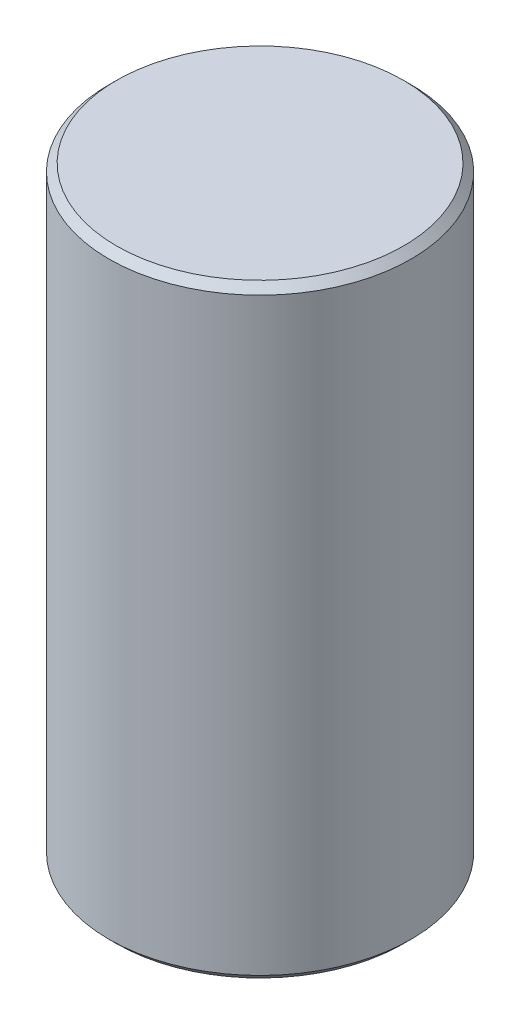
ISO-10303-21;
HEADER;
FILE_DESCRIPTION(('STEP AP214'),'2;1');
FILE_NAME('part.step','',(''),(''),'','','');
FILE_SCHEMA(('AUTOMOTIVE_DESIGN { 1 0 10303 214 1 1 1 1 }'));
ENDSEC;
DATA;
#1=APPLICATION_CONTEXT('core data for automotive mechanical design processes');
#2=APPLICATION_PROTOCOL_DEFINITION('international standard','automotive_design',2000,#1);
#3=PRODUCT_CONTEXT('',#1,'mechanical');
#4=PRODUCT('Part','Part','',(#3));
#5=PRODUCT_RELATED_PRODUCT_CATEGORY('part','',(#4));
#6=PRODUCT_DEFINITION_FORMATION('','',#4);
#7=PRODUCT_DEFINITION_CONTEXT('part definition',#1,'design');
#8=PRODUCT_DEFINITION('design','',#6,#7);
#9=PRODUCT_DEFINITION_SHAPE('','',#8);
#10=(LENGTH_UNIT() NAMED_UNIT(*) SI_UNIT(.MILLI.,.METRE.));
#11=(NAMED_UNIT(*) PLANE_ANGLE_UNIT() SI_UNIT($,.RADIAN.));
#12=(NAMED_UNIT(*) SI_UNIT($,.STERADIAN.) SOLID_ANGLE_UNIT());
#13=UNCERTAINTY_MEASURE_WITH_UNIT(LENGTH_MEASURE(1.E-05),#10,'distance_accuracy_value','');
#14=(GEOMETRIC_REPRESENTATION_CONTEXT(3) GLOBAL_UNCERTAINTY_ASSIGNED_CONTEXT((#13)) GLOBAL_UNIT_ASSIGNED_CONTEXT((#10,
#11,#12)) REPRESENTATION_CONTEXT('',''));
#15=CARTESIAN_POINT('',(0.,0.,0.));
#16=DIRECTION('',(0.,0.,1.));
#17=DIRECTION('',(1.,0.,0.));
#18=AXIS2_PLACEMENT_3D('',#15,#16,#17);
#19=CARTESIAN_POINT('',(0.,5.,0.));
#20=DIRECTION('',(0.,-1.,0.));
#21=DIRECTION('',(0.,0.,-1.));
#22=AXIS2_PLACEMENT_3D('',#19,#20,#21);
#23=CYLINDRICAL_SURFACE('',#22,2.5);
#24=CARTESIAN_POINT('',(0.,-4.875,0.));
#25=DIRECTION('',(0.,1.,0.));
#26=DIRECTION('',(0.,0.,1.));
#27=AXIS2_PLACEMENT_3D('',#24,#25,#26);
#28=CIRCLE('',#27,2.5);
#29=CARTESIAN_POINT('',(0.,-4.875,2.5));
#30=VERTEX_POINT('',#29);
#31=EDGE_CURVE('E53',#30,#30,#28,.T.);
#32=ORIENTED_EDGE('',*,*,#31,.T.);
#33=EDGE_LOOP('',(#32));
#34=FACE_BOUND('',#33,.T.);
#35=CARTESIAN_POINT('',(0.,4.875,0.));
#36=DIRECTION('',(0.,1.,0.));
#37=DIRECTION('',(0.,0.,1.));
#38=AXIS2_PLACEMENT_3D('',#35,#36,#37);
#39=CIRCLE('',#38,2.5);
#40=CARTESIAN_POINT('',(0.,4.875,2.5));
#41=VERTEX_POINT('',#40);
#42=EDGE_CURVE('E57',#41,#41,#39,.F.);
#43=ORIENTED_EDGE('',*,*,#42,.T.);
#44=EDGE_LOOP('',(#43));
#45=FACE_BOUND('',#44,.T.);
#46=ADVANCED_FACE('F41',(#34,#45),#23,.T.);
#47=CARTESIAN_POINT('',(0.,5.,0.));
#48=DIRECTION('',(0.,1.,0.));
#49=DIRECTION('',(0.,0.,1.));
#50=AXIS2_PLACEMENT_3D('',#47,#48,#49);
#51=PLANE('',#50);
#52=CARTESIAN_POINT('',(0.,5.,0.));
#53=DIRECTION('',(0.,1.,0.));
#54=DIRECTION('',(0.,0.,1.));
#55=AXIS2_PLACEMENT_3D('',#52,#53,#54);
#56=CIRCLE('',#55,2.375);
#57=CARTESIAN_POINT('',(0.,5.,2.375));
#58=VERTEX_POINT('',#57);
#59=EDGE_CURVE('E10',#58,#58,#56,.T.);
#60=ORIENTED_EDGE('',*,*,#59,.T.);
#61=EDGE_LOOP('',(#60));
#62=FACE_BOUND('',#61,.T.);
#63=ADVANCED_FACE('F73',(#62),#51,.T.);
#64=CARTESIAN_POINT('',(0.,-5.,0.));
#65=DIRECTION('',(0.,1.,0.));
#66=DIRECTION('',(0.,0.,1.));
#67=AXIS2_PLACEMENT_3D('',#64,#65,#66);
#68=PLANE('',#67);
#69=CARTESIAN_POINT('',(0.,-5.,0.));
#70=DIRECTION('',(0.,1.,0.));
#71=DIRECTION('',(0.,0.,1.));
#72=AXIS2_PLACEMENT_3D('',#69,#70,#71);
#73=CIRCLE('',#72,2.375);
#74=CARTESIAN_POINT('',(0.,-5.,2.375));
#75=VERTEX_POINT('',#74);
#76=EDGE_CURVE('E49',#75,#75,#73,.F.);
#77=ORIENTED_EDGE('',*,*,#76,.T.);
#78=EDGE_LOOP('',(#77));
#79=FACE_BOUND('',#78,.T.);
#80=ADVANCED_FACE('F70',(#79),#68,.F.);
#81=CARTESIAN_POINT('',(0.,-4.875,0.));
#82=DIRECTION('',(0.,1.,0.));
#83=DIRECTION('',(0.,0.,1.));
#84=AXIS2_PLACEMENT_3D('',#81,#82,#83);
#85=CONICAL_SURFACE('',#84,2.5,0.78539816339745);
#86=ORIENTED_EDGE('',*,*,#76,.F.);
#87=EDGE_LOOP('',(#86));
#88=FACE_BOUND('',#87,.T.);
#89=ORIENTED_EDGE('',*,*,#31,.F.);
#90=EDGE_LOOP('',(#89));
#91=FACE_BOUND('',#90,.T.);
#92=ADVANCED_FACE('F66',(#88,#91),#85,.T.);
#93=CARTESIAN_POINT('',(0.,5.,0.));
#94=DIRECTION('',(0.,-1.,0.));
#95=DIRECTION('',(0.,0.,-1.));
#96=AXIS2_PLACEMENT_3D('',#93,#94,#95);
#97=CONICAL_SURFACE('',#96,2.375,0.785398163397443);
#98=ORIENTED_EDGE('',*,*,#42,.F.);
#99=EDGE_LOOP('',(#98));
#100=FACE_BOUND('',#99,.T.);
#101=ORIENTED_EDGE('',*,*,#59,.F.);
#102=EDGE_LOOP('',(#101));
#103=FACE_BOUND('',#102,.T.);
#104=ADVANCED_FACE('F44',(#100,#103),#97,.T.);
#105=CLOSED_SHELL('',(#46,#63,#80,#92,#104));
#106=MANIFOLD_SOLID_BREP('B2',#105);
#107=ADVANCED_BREP_SHAPE_REPRESENTATION('',(#18,#106),#14);
#108=SHAPE_DEFINITION_REPRESENTATION(#9,#107);
ENDSEC;
END-ISO-10303-21;
